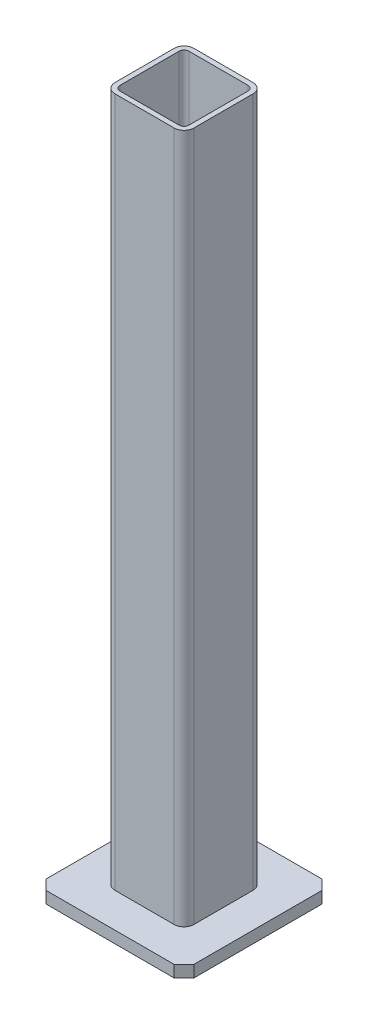
ISO-10303-21;
HEADER;
FILE_DESCRIPTION(('STEP AP214'),'2;1');
FILE_NAME('part.step','',(''),(''),'','','');
FILE_SCHEMA(('AUTOMOTIVE_DESIGN { 1 0 10303 214 1 1 1 1 }'));
ENDSEC;
DATA;
#1=APPLICATION_CONTEXT('core data for automotive mechanical design processes');
#2=APPLICATION_PROTOCOL_DEFINITION('international standard','automotive_design',2000,#1);
#3=PRODUCT_CONTEXT('',#1,'mechanical');
#4=PRODUCT('Part','Part','',(#3));
#5=PRODUCT_RELATED_PRODUCT_CATEGORY('part','',(#4));
#6=PRODUCT_DEFINITION_FORMATION('','',#4);
#7=PRODUCT_DEFINITION_CONTEXT('part definition',#1,'design');
#8=PRODUCT_DEFINITION('design','',#6,#7);
#9=PRODUCT_DEFINITION_SHAPE('','',#8);
#10=(LENGTH_UNIT() NAMED_UNIT(*) SI_UNIT(.MILLI.,.METRE.));
#11=(NAMED_UNIT(*) PLANE_ANGLE_UNIT() SI_UNIT($,.RADIAN.));
#12=(NAMED_UNIT(*) SI_UNIT($,.STERADIAN.) SOLID_ANGLE_UNIT());
#13=UNCERTAINTY_MEASURE_WITH_UNIT(LENGTH_MEASURE(1.E-05),#10,'distance_accuracy_value','');
#14=(GEOMETRIC_REPRESENTATION_CONTEXT(3) GLOBAL_UNCERTAINTY_ASSIGNED_CONTEXT((#13)) GLOBAL_UNIT_ASSIGNED_CONTEXT((#10,
#11,#12)) REPRESENTATION_CONTEXT('',''));
#15=CARTESIAN_POINT('',(0.,0.,0.));
#16=DIRECTION('',(0.,0.,1.));
#17=DIRECTION('',(1.,0.,0.));
#18=AXIS2_PLACEMENT_3D('',#15,#16,#17);
#19=CARTESIAN_POINT('',(-75.,-12.,-75.));
#20=DIRECTION('',(1.,0.,0.));
#21=DIRECTION('',(0.,0.,-1.));
#22=AXIS2_PLACEMENT_3D('',#19,#20,#21);
#23=PLANE('',#22);
#24=DIRECTION('',(0.,0.,-1.));
#25=VECTOR('',#24,1.);
#26=CARTESIAN_POINT('',(-75.,0.,-75.));
#27=LINE('',#26,#25);
#28=CARTESIAN_POINT('',(-75.,0.,64.9999999999999));
#29=VERTEX_POINT('',#28);
#30=CARTESIAN_POINT('',(-75.,0.,-65.));
#31=VERTEX_POINT('',#30);
#32=EDGE_CURVE('E211',#29,#31,#27,.T.);
#33=ORIENTED_EDGE('',*,*,#32,.T.);
#34=DIRECTION('',(0.,-1.,0.));
#35=VECTOR('',#34,1.);
#36=CARTESIAN_POINT('',(-75.,-12.,-65.));
#37=LINE('',#36,#35);
#38=CARTESIAN_POINT('',(-75.,-12.,-65.));
#39=VERTEX_POINT('',#38);
#40=EDGE_CURVE('E91',#31,#39,#37,.T.);
#41=ORIENTED_EDGE('',*,*,#40,.T.);
#42=DIRECTION('',(0.,0.,-1.));
#43=VECTOR('',#42,1.);
#44=CARTESIAN_POINT('',(-75.,-12.,-75.));
#45=LINE('',#44,#43);
#46=CARTESIAN_POINT('',(-75.,-12.,64.9999999999999));
#47=VERTEX_POINT('',#46);
#48=EDGE_CURVE('E170',#47,#39,#45,.T.);
#49=ORIENTED_EDGE('',*,*,#48,.F.);
#50=DIRECTION('',(0.,1.,0.));
#51=VECTOR('',#50,1.);
#52=CARTESIAN_POINT('',(-75.,-12.,64.9999999999999));
#53=LINE('',#52,#51);
#54=EDGE_CURVE('E182',#47,#29,#53,.T.);
#55=ORIENTED_EDGE('',*,*,#54,.T.);
#56=EDGE_LOOP('',(#33,#41,#49,#55));
#57=FACE_BOUND('',#56,.T.);
#58=ADVANCED_FACE('F82',(#57),#23,.F.);
#59=CARTESIAN_POINT('',(75.,-12.,-75.));
#60=DIRECTION('',(0.,0.,1.));
#61=DIRECTION('',(1.,0.,0.));
#62=AXIS2_PLACEMENT_3D('',#59,#60,#61);
#63=PLANE('',#62);
#64=DIRECTION('',(1.,0.,0.));
#65=VECTOR('',#64,1.);
#66=CARTESIAN_POINT('',(75.,-12.,-75.));
#67=LINE('',#66,#65);
#68=CARTESIAN_POINT('',(-64.9999999999999,-12.,-75.));
#69=VERTEX_POINT('',#68);
#70=CARTESIAN_POINT('',(64.9999999999999,-12.,-75.));
#71=VERTEX_POINT('',#70);
#72=EDGE_CURVE('E173',#69,#71,#67,.T.);
#73=ORIENTED_EDGE('',*,*,#72,.F.);
#74=DIRECTION('',(0.,1.,0.));
#75=VECTOR('',#74,1.);
#76=CARTESIAN_POINT('',(-64.9999999999999,-12.,-75.));
#77=LINE('',#76,#75);
#78=CARTESIAN_POINT('',(-64.9999999999999,0.,-75.));
#79=VERTEX_POINT('',#78);
#80=EDGE_CURVE('E201',#69,#79,#77,.T.);
#81=ORIENTED_EDGE('',*,*,#80,.T.);
#82=DIRECTION('',(1.,0.,0.));
#83=VECTOR('',#82,1.);
#84=CARTESIAN_POINT('',(75.,0.,-75.));
#85=LINE('',#84,#83);
#86=CARTESIAN_POINT('',(64.9999999999999,0.,-75.));
#87=VERTEX_POINT('',#86);
#88=EDGE_CURVE('E175',#79,#87,#85,.T.);
#89=ORIENTED_EDGE('',*,*,#88,.T.);
#90=DIRECTION('',(0.,-1.,0.));
#91=VECTOR('',#90,1.);
#92=CARTESIAN_POINT('',(64.9999999999999,-12.,-75.));
#93=LINE('',#92,#91);
#94=EDGE_CURVE('E196',#87,#71,#93,.T.);
#95=ORIENTED_EDGE('',*,*,#94,.T.);
#96=EDGE_LOOP('',(#73,#81,#89,#95));
#97=FACE_BOUND('',#96,.T.);
#98=ADVANCED_FACE('F207',(#97),#63,.F.);
#99=CARTESIAN_POINT('',(75.,-12.,-75.));
#100=DIRECTION('',(-1.,0.,0.));
#101=DIRECTION('',(0.,0.,1.));
#102=AXIS2_PLACEMENT_3D('',#99,#100,#101);
#103=PLANE('',#102);
#104=DIRECTION('',(0.,0.,1.));
#105=VECTOR('',#104,1.);
#106=CARTESIAN_POINT('',(75.,-12.,-75.));
#107=LINE('',#106,#105);
#108=CARTESIAN_POINT('',(75.,-12.,-64.9999999999999));
#109=VERTEX_POINT('',#108);
#110=CARTESIAN_POINT('',(75.,-12.,64.9999999999999));
#111=VERTEX_POINT('',#110);
#112=EDGE_CURVE('E215',#109,#111,#107,.T.);
#113=ORIENTED_EDGE('',*,*,#112,.F.);
#114=DIRECTION('',(0.,1.,0.));
#115=VECTOR('',#114,1.);
#116=CARTESIAN_POINT('',(75.,-12.,-64.9999999999999));
#117=LINE('',#116,#115);
#118=CARTESIAN_POINT('',(75.,0.,-64.9999999999999));
#119=VERTEX_POINT('',#118);
#120=EDGE_CURVE('E190',#109,#119,#117,.T.);
#121=ORIENTED_EDGE('',*,*,#120,.T.);
#122=DIRECTION('',(0.,0.,1.));
#123=VECTOR('',#122,1.);
#124=CARTESIAN_POINT('',(75.,0.,-75.));
#125=LINE('',#124,#123);
#126=CARTESIAN_POINT('',(75.,0.,64.9999999999999));
#127=VERTEX_POINT('',#126);
#128=EDGE_CURVE('E171',#119,#127,#125,.T.);
#129=ORIENTED_EDGE('',*,*,#128,.T.);
#130=DIRECTION('',(0.,-1.,0.));
#131=VECTOR('',#130,1.);
#132=CARTESIAN_POINT('',(75.,-12.,64.9999999999999));
#133=LINE('',#132,#131);
#134=EDGE_CURVE('E155',#127,#111,#133,.T.);
#135=ORIENTED_EDGE('',*,*,#134,.T.);
#136=EDGE_LOOP('',(#113,#121,#129,#135));
#137=FACE_BOUND('',#136,.T.);
#138=ADVANCED_FACE('F225',(#137),#103,.F.);
#139=CARTESIAN_POINT('',(75.,-12.,75.));
#140=DIRECTION('',(0.,0.,-1.));
#141=DIRECTION('',(-1.,0.,0.));
#142=AXIS2_PLACEMENT_3D('',#139,#140,#141);
#143=PLANE('',#142);
#144=DIRECTION('',(-1.,0.,0.));
#145=VECTOR('',#144,1.);
#146=CARTESIAN_POINT('',(75.,0.,75.));
#147=LINE('',#146,#145);
#148=CARTESIAN_POINT('',(64.9999999999999,0.,75.));
#149=VERTEX_POINT('',#148);
#150=CARTESIAN_POINT('',(-64.9999999999999,0.,75.));
#151=VERTEX_POINT('',#150);
#152=EDGE_CURVE('E163',#149,#151,#147,.T.);
#153=ORIENTED_EDGE('',*,*,#152,.T.);
#154=DIRECTION('',(0.,-1.,0.));
#155=VECTOR('',#154,1.);
#156=CARTESIAN_POINT('',(-64.9999999999999,-12.,75.));
#157=LINE('',#156,#155);
#158=CARTESIAN_POINT('',(-64.9999999999999,-12.,75.));
#159=VERTEX_POINT('',#158);
#160=EDGE_CURVE('E186',#151,#159,#157,.T.);
#161=ORIENTED_EDGE('',*,*,#160,.T.);
#162=DIRECTION('',(-1.,0.,0.));
#163=VECTOR('',#162,1.);
#164=CARTESIAN_POINT('',(75.,-12.,75.));
#165=LINE('',#164,#163);
#166=CARTESIAN_POINT('',(64.9999999999999,-12.,75.));
#167=VERTEX_POINT('',#166);
#168=EDGE_CURVE('E166',#167,#159,#165,.T.);
#169=ORIENTED_EDGE('',*,*,#168,.F.);
#170=DIRECTION('',(0.,1.,0.));
#171=VECTOR('',#170,1.);
#172=CARTESIAN_POINT('',(64.9999999999999,-12.,75.));
#173=LINE('',#172,#171);
#174=EDGE_CURVE('E153',#167,#149,#173,.T.);
#175=ORIENTED_EDGE('',*,*,#174,.T.);
#176=EDGE_LOOP('',(#153,#161,#169,#175));
#177=FACE_BOUND('',#176,.T.);
#178=ADVANCED_FACE('F162',(#177),#143,.F.);
#179=CARTESIAN_POINT('',(0.,-12.,0.));
#180=DIRECTION('',(0.,-1.,0.));
#181=DIRECTION('',(0.,0.,-1.));
#182=AXIS2_PLACEMENT_3D('',#179,#180,#181);
#183=PLANE('',#182);
#184=ORIENTED_EDGE('',*,*,#48,.T.);
#185=DIRECTION('',(-0.707106781186548,0.,0.707106781186548));
#186=VECTOR('',#185,1.);
#187=CARTESIAN_POINT('',(-70.,-12.,-70.));
#188=LINE('',#187,#186);
#189=EDGE_CURVE('E13',#39,#69,#188,.F.);
#190=ORIENTED_EDGE('',*,*,#189,.T.);
#191=ORIENTED_EDGE('',*,*,#72,.T.);
#192=DIRECTION('',(-0.707106781186548,0.,-0.707106781186548));
#193=VECTOR('',#192,1.);
#194=CARTESIAN_POINT('',(70.,-12.,-70.));
#195=LINE('',#194,#193);
#196=EDGE_CURVE('E199',#71,#109,#195,.F.);
#197=ORIENTED_EDGE('',*,*,#196,.T.);
#198=ORIENTED_EDGE('',*,*,#112,.T.);
#199=DIRECTION('',(0.707106781186548,0.,-0.707106781186547));
#200=VECTOR('',#199,1.);
#201=CARTESIAN_POINT('',(69.9999999999999,-12.,70.));
#202=LINE('',#201,#200);
#203=EDGE_CURVE('E180',#111,#167,#202,.F.);
#204=ORIENTED_EDGE('',*,*,#203,.T.);
#205=ORIENTED_EDGE('',*,*,#168,.T.);
#206=DIRECTION('',(0.707106781186548,0.,0.707106781186548));
#207=VECTOR('',#206,1.);
#208=CARTESIAN_POINT('',(-70.,-12.,70.));
#209=LINE('',#208,#207);
#210=EDGE_CURVE('E188',#159,#47,#209,.F.);
#211=ORIENTED_EDGE('',*,*,#210,.T.);
#212=EDGE_LOOP('',(#184,#190,#191,#197,#198,#204,#205,#211));
#213=FACE_BOUND('',#212,.T.);
#214=ADVANCED_FACE('F218',(#213),#183,.T.);
#215=CARTESIAN_POINT('',(0.,0.,0.));
#216=DIRECTION('',(0.,-1.,0.));
#217=DIRECTION('',(0.,0.,-1.));
#218=AXIS2_PLACEMENT_3D('',#215,#216,#217);
#219=PLANE('',#218);
#220=ORIENTED_EDGE('',*,*,#88,.F.);
#221=DIRECTION('',(0.707106781186548,0.,-0.707106781186548));
#222=VECTOR('',#221,1.);
#223=CARTESIAN_POINT('',(-64.9999999999999,0.,-75.));
#224=LINE('',#223,#222);
#225=EDGE_CURVE('E105',#79,#31,#224,.F.);
#226=ORIENTED_EDGE('',*,*,#225,.T.);
#227=ORIENTED_EDGE('',*,*,#32,.F.);
#228=DIRECTION('',(-0.707106781186548,0.,-0.707106781186548));
#229=VECTOR('',#228,1.);
#230=CARTESIAN_POINT('',(-75.,0.,64.9999999999999));
#231=LINE('',#230,#229);
#232=EDGE_CURVE('E169',#29,#151,#231,.F.);
#233=ORIENTED_EDGE('',*,*,#232,.T.);
#234=ORIENTED_EDGE('',*,*,#152,.F.);
#235=DIRECTION('',(-0.707106781186548,0.,0.707106781186547));
#236=VECTOR('',#235,1.);
#237=CARTESIAN_POINT('',(64.9999999999999,0.,75.));
#238=LINE('',#237,#236);
#239=EDGE_CURVE('E149',#149,#127,#238,.F.);
#240=ORIENTED_EDGE('',*,*,#239,.T.);
#241=ORIENTED_EDGE('',*,*,#128,.F.);
#242=DIRECTION('',(0.707106781186548,0.,0.707106781186548));
#243=VECTOR('',#242,1.);
#244=CARTESIAN_POINT('',(75.,0.,-64.9999999999999));
#245=LINE('',#244,#243);
#246=EDGE_CURVE('E193',#119,#87,#245,.F.);
#247=ORIENTED_EDGE('',*,*,#246,.T.);
#248=EDGE_LOOP('',(#220,#226,#227,#233,#234,#240,#241,#247));
#249=FACE_BOUND('',#248,.T.);
#250=ADVANCED_FACE('F168',(#249),#219,.F.);
#251=CARTESIAN_POINT('',(64.9999999999999,-12.,75.));
#252=DIRECTION('',(-0.707106781186547,0.,-0.707106781186548));
#253=DIRECTION('',(0.,1.,0.));
#254=AXIS2_PLACEMENT_3D('',#251,#252,#253);
#255=PLANE('',#254);
#256=ORIENTED_EDGE('',*,*,#203,.F.);
#257=ORIENTED_EDGE('',*,*,#134,.F.);
#258=ORIENTED_EDGE('',*,*,#239,.F.);
#259=ORIENTED_EDGE('',*,*,#174,.F.);
#260=EDGE_LOOP('',(#256,#257,#258,#259));
#261=FACE_BOUND('',#260,.T.);
#262=ADVANCED_FACE('F152',(#261),#255,.F.);
#263=CARTESIAN_POINT('',(-75.,-12.,64.9999999999999));
#264=DIRECTION('',(0.707106781186547,0.,-0.707106781186547));
#265=DIRECTION('',(0.,1.,0.));
#266=AXIS2_PLACEMENT_3D('',#263,#264,#265);
#267=PLANE('',#266);
#268=ORIENTED_EDGE('',*,*,#210,.F.);
#269=ORIENTED_EDGE('',*,*,#160,.F.);
#270=ORIENTED_EDGE('',*,*,#232,.F.);
#271=ORIENTED_EDGE('',*,*,#54,.F.);
#272=EDGE_LOOP('',(#268,#269,#270,#271));
#273=FACE_BOUND('',#272,.T.);
#274=ADVANCED_FACE('F229',(#273),#267,.F.);
#275=CARTESIAN_POINT('',(75.,-12.,-64.9999999999999));
#276=DIRECTION('',(-0.707106781186548,0.,0.707106781186548));
#277=DIRECTION('',(0.,1.,0.));
#278=AXIS2_PLACEMENT_3D('',#275,#276,#277);
#279=PLANE('',#278);
#280=ORIENTED_EDGE('',*,*,#196,.F.);
#281=ORIENTED_EDGE('',*,*,#94,.F.);
#282=ORIENTED_EDGE('',*,*,#246,.F.);
#283=ORIENTED_EDGE('',*,*,#120,.F.);
#284=EDGE_LOOP('',(#280,#281,#282,#283));
#285=FACE_BOUND('',#284,.T.);
#286=ADVANCED_FACE('F223',(#285),#279,.F.);
#287=CARTESIAN_POINT('',(-64.9999999999999,-12.,-75.));
#288=DIRECTION('',(0.707106781186547,0.,0.707106781186547));
#289=DIRECTION('',(0.,1.,0.));
#290=AXIS2_PLACEMENT_3D('',#287,#288,#289);
#291=PLANE('',#290);
#292=ORIENTED_EDGE('',*,*,#189,.F.);
#293=ORIENTED_EDGE('',*,*,#40,.F.);
#294=ORIENTED_EDGE('',*,*,#225,.F.);
#295=ORIENTED_EDGE('',*,*,#80,.F.);
#296=EDGE_LOOP('',(#292,#293,#294,#295));
#297=FACE_BOUND('',#296,.T.);
#298=ADVANCED_FACE('F85',(#297),#291,.F.);
#299=CLOSED_SHELL('',(#58,#98,#138,#178,#214,#250,#262,#274,#286,#298));
#300=MANIFOLD_SOLID_BREP('B2',#299);
#301=CARTESIAN_POINT('',(-30.,700.,30.));
#302=DIRECTION('',(0.,-1.,0.));
#303=DIRECTION('',(0.,0.,-1.));
#304=AXIS2_PLACEMENT_3D('',#301,#302,#303);
#305=CYLINDRICAL_SURFACE('',#304,10.);
#306=CARTESIAN_POINT('',(-30.,0.,30.));
#307=DIRECTION('',(0.,1.,0.));
#308=DIRECTION('',(0.,0.,1.));
#309=AXIS2_PLACEMENT_3D('',#306,#307,#308);
#310=CIRCLE('',#309,10.);
#311=CARTESIAN_POINT('',(-40.,0.,30.));
#312=VERTEX_POINT('',#311);
#313=CARTESIAN_POINT('',(-30.,0.,40.));
#314=VERTEX_POINT('',#313);
#315=EDGE_CURVE('E513',#312,#314,#310,.T.);
#316=ORIENTED_EDGE('',*,*,#315,.T.);
#317=DIRECTION('',(0.,-1.,0.));
#318=VECTOR('',#317,1.);
#319=CARTESIAN_POINT('',(-30.,700.,40.));
#320=LINE('',#319,#318);
#321=CARTESIAN_POINT('',(-30.,700.,40.));
#322=VERTEX_POINT('',#321);
#323=EDGE_CURVE('E80',#322,#314,#320,.T.);
#324=ORIENTED_EDGE('',*,*,#323,.F.);
#325=CARTESIAN_POINT('',(-30.,700.,30.));
#326=DIRECTION('',(0.,1.,0.));
#327=DIRECTION('',(0.,0.,1.));
#328=AXIS2_PLACEMENT_3D('',#325,#326,#327);
#329=CIRCLE('',#328,10.);
#330=CARTESIAN_POINT('',(-40.,700.,30.));
#331=VERTEX_POINT('',#330);
#332=EDGE_CURVE('E591',#331,#322,#329,.T.);
#333=ORIENTED_EDGE('',*,*,#332,.F.);
#334=DIRECTION('',(0.,-1.,0.));
#335=VECTOR('',#334,1.);
#336=CARTESIAN_POINT('',(-40.,700.,30.));
#337=LINE('',#336,#335);
#338=EDGE_CURVE('E528',#331,#312,#337,.T.);
#339=ORIENTED_EDGE('',*,*,#338,.T.);
#340=EDGE_LOOP('',(#316,#324,#333,#339));
#341=FACE_BOUND('',#340,.T.);
#342=ADVANCED_FACE('F341',(#341),#305,.T.);
#343=CARTESIAN_POINT('',(-30.,700.,40.));
#344=DIRECTION('',(0.,0.,-1.));
#345=DIRECTION('',(-1.,0.,0.));
#346=AXIS2_PLACEMENT_3D('',#343,#344,#345);
#347=PLANE('',#346);
#348=DIRECTION('',(1.,0.,0.));
#349=VECTOR('',#348,1.);
#350=CARTESIAN_POINT('',(-30.,0.,40.));
#351=LINE('',#350,#349);
#352=CARTESIAN_POINT('',(30.,0.,40.));
#353=VERTEX_POINT('',#352);
#354=EDGE_CURVE('E516',#314,#353,#351,.T.);
#355=ORIENTED_EDGE('',*,*,#354,.T.);
#356=DIRECTION('',(0.,-1.,0.));
#357=VECTOR('',#356,1.);
#358=CARTESIAN_POINT('',(30.,700.,40.));
#359=LINE('',#358,#357);
#360=CARTESIAN_POINT('',(30.,700.,40.));
#361=VERTEX_POINT('',#360);
#362=EDGE_CURVE('E351',#361,#353,#359,.T.);
#363=ORIENTED_EDGE('',*,*,#362,.F.);
#364=DIRECTION('',(1.,0.,0.));
#365=VECTOR('',#364,1.);
#366=CARTESIAN_POINT('',(-30.,700.,40.));
#367=LINE('',#366,#365);
#368=EDGE_CURVE('E593',#322,#361,#367,.T.);
#369=ORIENTED_EDGE('',*,*,#368,.F.);
#370=ORIENTED_EDGE('',*,*,#323,.T.);
#371=EDGE_LOOP('',(#355,#363,#369,#370));
#372=FACE_BOUND('',#371,.T.);
#373=ADVANCED_FACE('F628',(#372),#347,.F.);
#374=CARTESIAN_POINT('',(30.,700.,30.));
#375=DIRECTION('',(0.,-1.,0.));
#376=DIRECTION('',(0.,0.,-1.));
#377=AXIS2_PLACEMENT_3D('',#374,#375,#376);
#378=CYLINDRICAL_SURFACE('',#377,10.);
#379=CARTESIAN_POINT('',(30.,0.,30.));
#380=DIRECTION('',(0.,1.,0.));
#381=DIRECTION('',(0.,0.,1.));
#382=AXIS2_PLACEMENT_3D('',#379,#380,#381);
#383=CIRCLE('',#382,10.);
#384=CARTESIAN_POINT('',(40.,0.,30.));
#385=VERTEX_POINT('',#384);
#386=EDGE_CURVE('E518',#353,#385,#383,.T.);
#387=ORIENTED_EDGE('',*,*,#386,.T.);
#388=DIRECTION('',(0.,-1.,0.));
#389=VECTOR('',#388,1.);
#390=CARTESIAN_POINT('',(40.,700.,30.));
#391=LINE('',#390,#389);
#392=CARTESIAN_POINT('',(40.,700.,30.));
#393=VERTEX_POINT('',#392);
#394=EDGE_CURVE('E535',#393,#385,#391,.T.);
#395=ORIENTED_EDGE('',*,*,#394,.F.);
#396=CARTESIAN_POINT('',(30.,700.,30.));
#397=DIRECTION('',(0.,1.,0.));
#398=DIRECTION('',(0.,0.,1.));
#399=AXIS2_PLACEMENT_3D('',#396,#397,#398);
#400=CIRCLE('',#399,10.);
#401=EDGE_CURVE('E595',#361,#393,#400,.T.);
#402=ORIENTED_EDGE('',*,*,#401,.F.);
#403=ORIENTED_EDGE('',*,*,#362,.T.);
#404=EDGE_LOOP('',(#387,#395,#402,#403));
#405=FACE_BOUND('',#404,.T.);
#406=ADVANCED_FACE('F633',(#405),#378,.T.);
#407=CARTESIAN_POINT('',(40.,700.,-30.));
#408=DIRECTION('',(-1.,0.,0.));
#409=DIRECTION('',(0.,0.,1.));
#410=AXIS2_PLACEMENT_3D('',#407,#408,#409);
#411=PLANE('',#410);
#412=DIRECTION('',(0.,0.,-1.));
#413=VECTOR('',#412,1.);
#414=CARTESIAN_POINT('',(40.,0.,-30.));
#415=LINE('',#414,#413);
#416=CARTESIAN_POINT('',(40.,0.,-30.));
#417=VERTEX_POINT('',#416);
#418=EDGE_CURVE('E520',#385,#417,#415,.T.);
#419=ORIENTED_EDGE('',*,*,#418,.T.);
#420=DIRECTION('',(0.,-1.,0.));
#421=VECTOR('',#420,1.);
#422=CARTESIAN_POINT('',(40.,700.,-30.));
#423=LINE('',#422,#421);
#424=CARTESIAN_POINT('',(40.,700.,-30.));
#425=VERTEX_POINT('',#424);
#426=EDGE_CURVE('E532',#425,#417,#423,.T.);
#427=ORIENTED_EDGE('',*,*,#426,.F.);
#428=DIRECTION('',(0.,0.,-1.));
#429=VECTOR('',#428,1.);
#430=CARTESIAN_POINT('',(40.,700.,-30.));
#431=LINE('',#430,#429);
#432=EDGE_CURVE('E597',#393,#425,#431,.T.);
#433=ORIENTED_EDGE('',*,*,#432,.F.);
#434=ORIENTED_EDGE('',*,*,#394,.T.);
#435=EDGE_LOOP('',(#419,#427,#433,#434));
#436=FACE_BOUND('',#435,.T.);
#437=ADVANCED_FACE('F603',(#436),#411,.F.);
#438=CARTESIAN_POINT('',(30.,700.,-30.));
#439=DIRECTION('',(0.,-1.,0.));
#440=DIRECTION('',(0.,0.,-1.));
#441=AXIS2_PLACEMENT_3D('',#438,#439,#440);
#442=CYLINDRICAL_SURFACE('',#441,10.);
#443=CARTESIAN_POINT('',(30.,0.,-30.));
#444=DIRECTION('',(0.,1.,0.));
#445=DIRECTION('',(0.,0.,1.));
#446=AXIS2_PLACEMENT_3D('',#443,#444,#445);
#447=CIRCLE('',#446,10.);
#448=CARTESIAN_POINT('',(30.,0.,-40.));
#449=VERTEX_POINT('',#448);
#450=EDGE_CURVE('E522',#417,#449,#447,.T.);
#451=ORIENTED_EDGE('',*,*,#450,.T.);
#452=DIRECTION('',(0.,-1.,0.));
#453=VECTOR('',#452,1.);
#454=CARTESIAN_POINT('',(30.,700.,-40.));
#455=LINE('',#454,#453);
#456=CARTESIAN_POINT('',(30.,700.,-40.));
#457=VERTEX_POINT('',#456);
#458=EDGE_CURVE('E480',#457,#449,#455,.T.);
#459=ORIENTED_EDGE('',*,*,#458,.F.);
#460=CARTESIAN_POINT('',(30.,700.,-30.));
#461=DIRECTION('',(0.,1.,0.));
#462=DIRECTION('',(0.,0.,1.));
#463=AXIS2_PLACEMENT_3D('',#460,#461,#462);
#464=CIRCLE('',#463,10.);
#465=EDGE_CURVE('E471',#425,#457,#464,.T.);
#466=ORIENTED_EDGE('',*,*,#465,.F.);
#467=ORIENTED_EDGE('',*,*,#426,.T.);
#468=EDGE_LOOP('',(#451,#459,#466,#467));
#469=FACE_BOUND('',#468,.T.);
#470=ADVANCED_FACE('F607',(#469),#442,.T.);
#471=CARTESIAN_POINT('',(30.,700.,-40.));
#472=DIRECTION('',(0.,0.,1.));
#473=DIRECTION('',(1.,0.,0.));
#474=AXIS2_PLACEMENT_3D('',#471,#472,#473);
#475=PLANE('',#474);
#476=DIRECTION('',(-1.,0.,0.));
#477=VECTOR('',#476,1.);
#478=CARTESIAN_POINT('',(30.,0.,-40.));
#479=LINE('',#478,#477);
#480=CARTESIAN_POINT('',(-30.,0.,-40.));
#481=VERTEX_POINT('',#480);
#482=EDGE_CURVE('E479',#449,#481,#479,.T.);
#483=ORIENTED_EDGE('',*,*,#482,.T.);
#484=DIRECTION('',(0.,-1.,0.));
#485=VECTOR('',#484,1.);
#486=CARTESIAN_POINT('',(-30.,700.,-40.));
#487=LINE('',#486,#485);
#488=CARTESIAN_POINT('',(-30.,700.,-40.));
#489=VERTEX_POINT('',#488);
#490=EDGE_CURVE('E476',#489,#481,#487,.T.);
#491=ORIENTED_EDGE('',*,*,#490,.F.);
#492=DIRECTION('',(-1.,0.,0.));
#493=VECTOR('',#492,1.);
#494=CARTESIAN_POINT('',(30.,700.,-40.));
#495=LINE('',#494,#493);
#496=EDGE_CURVE('E465',#457,#489,#495,.T.);
#497=ORIENTED_EDGE('',*,*,#496,.F.);
#498=ORIENTED_EDGE('',*,*,#458,.T.);
#499=EDGE_LOOP('',(#483,#491,#497,#498));
#500=FACE_BOUND('',#499,.T.);
#501=ADVANCED_FACE('F477',(#500),#475,.F.);
#502=CARTESIAN_POINT('',(-30.,700.,-30.));
#503=DIRECTION('',(0.,-1.,0.));
#504=DIRECTION('',(0.,0.,-1.));
#505=AXIS2_PLACEMENT_3D('',#502,#503,#504);
#506=CYLINDRICAL_SURFACE('',#505,10.);
#507=CARTESIAN_POINT('',(-30.,0.,-30.));
#508=DIRECTION('',(0.,1.,0.));
#509=DIRECTION('',(0.,0.,1.));
#510=AXIS2_PLACEMENT_3D('',#507,#508,#509);
#511=CIRCLE('',#510,10.);
#512=CARTESIAN_POINT('',(-40.,0.,-30.));
#513=VERTEX_POINT('',#512);
#514=EDGE_CURVE('E413',#481,#513,#511,.T.);
#515=ORIENTED_EDGE('',*,*,#514,.T.);
#516=DIRECTION('',(0.,-1.,0.));
#517=VECTOR('',#516,1.);
#518=CARTESIAN_POINT('',(-40.,700.,-30.));
#519=LINE('',#518,#517);
#520=CARTESIAN_POINT('',(-40.,700.,-30.));
#521=VERTEX_POINT('',#520);
#522=EDGE_CURVE('E481',#521,#513,#519,.T.);
#523=ORIENTED_EDGE('',*,*,#522,.F.);
#524=CARTESIAN_POINT('',(-30.,700.,-30.));
#525=DIRECTION('',(0.,1.,0.));
#526=DIRECTION('',(0.,0.,1.));
#527=AXIS2_PLACEMENT_3D('',#524,#525,#526);
#528=CIRCLE('',#527,10.);
#529=EDGE_CURVE('E469',#489,#521,#528,.T.);
#530=ORIENTED_EDGE('',*,*,#529,.F.);
#531=ORIENTED_EDGE('',*,*,#490,.T.);
#532=EDGE_LOOP('',(#515,#523,#530,#531));
#533=FACE_BOUND('',#532,.T.);
#534=ADVANCED_FACE('F483',(#533),#506,.T.);
#535=CARTESIAN_POINT('',(30.,700.,30.));
#536=DIRECTION('',(0.,-1.,0.));
#537=DIRECTION('',(0.,0.,-1.));
#538=AXIS2_PLACEMENT_3D('',#535,#536,#537);
#539=CYLINDRICAL_SURFACE('',#538,5.);
#540=CARTESIAN_POINT('',(30.,0.,30.));
#541=DIRECTION('',(0.,1.,0.));
#542=DIRECTION('',(0.,0.,1.));
#543=AXIS2_PLACEMENT_3D('',#540,#541,#542);
#544=CIRCLE('',#543,5.);
#545=CARTESIAN_POINT('',(30.,0.,35.));
#546=VERTEX_POINT('',#545);
#547=CARTESIAN_POINT('',(35.,0.,30.));
#548=VERTEX_POINT('',#547);
#549=EDGE_CURVE('E489',#546,#548,#544,.T.);
#550=ORIENTED_EDGE('',*,*,#549,.F.);
#551=DIRECTION('',(0.,-1.,0.));
#552=VECTOR('',#551,1.);
#553=CARTESIAN_POINT('',(30.,700.,35.));
#554=LINE('',#553,#552);
#555=CARTESIAN_POINT('',(30.,700.,35.));
#556=VERTEX_POINT('',#555);
#557=EDGE_CURVE('E345',#556,#546,#554,.T.);
#558=ORIENTED_EDGE('',*,*,#557,.F.);
#559=CARTESIAN_POINT('',(30.,700.,30.));
#560=DIRECTION('',(0.,1.,0.));
#561=DIRECTION('',(0.,0.,1.));
#562=AXIS2_PLACEMENT_3D('',#559,#560,#561);
#563=CIRCLE('',#562,5.);
#564=CARTESIAN_POINT('',(35.,700.,30.));
#565=VERTEX_POINT('',#564);
#566=EDGE_CURVE('E527',#556,#565,#563,.T.);
#567=ORIENTED_EDGE('',*,*,#566,.T.);
#568=DIRECTION('',(0.,-1.,0.));
#569=VECTOR('',#568,1.);
#570=CARTESIAN_POINT('',(35.,700.,30.));
#571=LINE('',#570,#569);
#572=EDGE_CURVE('E485',#565,#548,#571,.T.);
#573=ORIENTED_EDGE('',*,*,#572,.T.);
#574=EDGE_LOOP('',(#550,#558,#567,#573));
#575=FACE_BOUND('',#574,.T.);
#576=ADVANCED_FACE('F343',(#575),#539,.F.);
#577=CARTESIAN_POINT('',(-30.,700.,35.));
#578=DIRECTION('',(0.,0.,-1.));
#579=DIRECTION('',(-1.,0.,0.));
#580=AXIS2_PLACEMENT_3D('',#577,#578,#579);
#581=PLANE('',#580);
#582=DIRECTION('',(1.,0.,0.));
#583=VECTOR('',#582,1.);
#584=CARTESIAN_POINT('',(-30.,0.,35.));
#585=LINE('',#584,#583);
#586=CARTESIAN_POINT('',(-30.,0.,35.));
#587=VERTEX_POINT('',#586);
#588=EDGE_CURVE('E492',#587,#546,#585,.T.);
#589=ORIENTED_EDGE('',*,*,#588,.F.);
#590=DIRECTION('',(0.,-1.,0.));
#591=VECTOR('',#590,1.);
#592=CARTESIAN_POINT('',(-30.,700.,35.));
#593=LINE('',#592,#591);
#594=CARTESIAN_POINT('',(-30.,700.,35.));
#595=VERTEX_POINT('',#594);
#596=EDGE_CURVE('E550',#595,#587,#593,.T.);
#597=ORIENTED_EDGE('',*,*,#596,.F.);
#598=DIRECTION('',(1.,0.,0.));
#599=VECTOR('',#598,1.);
#600=CARTESIAN_POINT('',(-30.,700.,35.));
#601=LINE('',#600,#599);
#602=EDGE_CURVE('E559',#595,#556,#601,.T.);
#603=ORIENTED_EDGE('',*,*,#602,.T.);
#604=ORIENTED_EDGE('',*,*,#557,.T.);
#605=EDGE_LOOP('',(#589,#597,#603,#604));
#606=FACE_BOUND('',#605,.T.);
#607=ADVANCED_FACE('F557',(#606),#581,.T.);
#608=CARTESIAN_POINT('',(-30.,700.,30.));
#609=DIRECTION('',(0.,-1.,0.));
#610=DIRECTION('',(0.,0.,-1.));
#611=AXIS2_PLACEMENT_3D('',#608,#609,#610);
#612=CYLINDRICAL_SURFACE('',#611,5.);
#613=CARTESIAN_POINT('',(-30.,0.,30.));
#614=DIRECTION('',(0.,1.,0.));
#615=DIRECTION('',(0.,0.,1.));
#616=AXIS2_PLACEMENT_3D('',#613,#614,#615);
#617=CIRCLE('',#616,5.);
#618=CARTESIAN_POINT('',(-35.,0.,30.));
#619=VERTEX_POINT('',#618);
#620=EDGE_CURVE('E495',#619,#587,#617,.T.);
#621=ORIENTED_EDGE('',*,*,#620,.F.);
#622=DIRECTION('',(0.,-1.,0.));
#623=VECTOR('',#622,1.);
#624=CARTESIAN_POINT('',(-35.,700.,30.));
#625=LINE('',#624,#623);
#626=CARTESIAN_POINT('',(-35.,700.,30.));
#627=VERTEX_POINT('',#626);
#628=EDGE_CURVE('E549',#627,#619,#625,.T.);
#629=ORIENTED_EDGE('',*,*,#628,.F.);
#630=CARTESIAN_POINT('',(-30.,700.,30.));
#631=DIRECTION('',(0.,1.,0.));
#632=DIRECTION('',(0.,0.,1.));
#633=AXIS2_PLACEMENT_3D('',#630,#631,#632);
#634=CIRCLE('',#633,5.);
#635=EDGE_CURVE('E567',#627,#595,#634,.T.);
#636=ORIENTED_EDGE('',*,*,#635,.T.);
#637=ORIENTED_EDGE('',*,*,#596,.T.);
#638=EDGE_LOOP('',(#621,#629,#636,#637));
#639=FACE_BOUND('',#638,.T.);
#640=ADVANCED_FACE('F565',(#639),#612,.F.);
#641=CARTESIAN_POINT('',(-35.,700.,30.));
#642=DIRECTION('',(1.,0.,0.));
#643=DIRECTION('',(0.,0.,-1.));
#644=AXIS2_PLACEMENT_3D('',#641,#642,#643);
#645=PLANE('',#644);
#646=DIRECTION('',(0.,0.,1.));
#647=VECTOR('',#646,1.);
#648=CARTESIAN_POINT('',(-35.,0.,30.));
#649=LINE('',#648,#647);
#650=CARTESIAN_POINT('',(-35.,0.,-30.));
#651=VERTEX_POINT('',#650);
#652=EDGE_CURVE('E498',#651,#619,#649,.T.);
#653=ORIENTED_EDGE('',*,*,#652,.F.);
#654=DIRECTION('',(0.,-1.,0.));
#655=VECTOR('',#654,1.);
#656=CARTESIAN_POINT('',(-35.,700.,-30.));
#657=LINE('',#656,#655);
#658=CARTESIAN_POINT('',(-35.,700.,-30.));
#659=VERTEX_POINT('',#658);
#660=EDGE_CURVE('E547',#659,#651,#657,.T.);
#661=ORIENTED_EDGE('',*,*,#660,.F.);
#662=DIRECTION('',(0.,0.,1.));
#663=VECTOR('',#662,1.);
#664=CARTESIAN_POINT('',(-35.,700.,30.));
#665=LINE('',#664,#663);
#666=EDGE_CURVE('E573',#659,#627,#665,.T.);
#667=ORIENTED_EDGE('',*,*,#666,.T.);
#668=ORIENTED_EDGE('',*,*,#628,.T.);
#669=EDGE_LOOP('',(#653,#661,#667,#668));
#670=FACE_BOUND('',#669,.T.);
#671=ADVANCED_FACE('F576',(#670),#645,.T.);
#672=CARTESIAN_POINT('',(-30.,700.,-30.));
#673=DIRECTION('',(0.,-1.,0.));
#674=DIRECTION('',(0.,0.,-1.));
#675=AXIS2_PLACEMENT_3D('',#672,#673,#674);
#676=CYLINDRICAL_SURFACE('',#675,5.);
#677=CARTESIAN_POINT('',(-30.,0.,-30.));
#678=DIRECTION('',(0.,1.,0.));
#679=DIRECTION('',(0.,0.,1.));
#680=AXIS2_PLACEMENT_3D('',#677,#678,#679);
#681=CIRCLE('',#680,5.);
#682=CARTESIAN_POINT('',(-30.,0.,-35.));
#683=VERTEX_POINT('',#682);
#684=EDGE_CURVE('E501',#683,#651,#681,.T.);
#685=ORIENTED_EDGE('',*,*,#684,.F.);
#686=DIRECTION('',(0.,-1.,0.));
#687=VECTOR('',#686,1.);
#688=CARTESIAN_POINT('',(-30.,700.,-35.));
#689=LINE('',#688,#687);
#690=CARTESIAN_POINT('',(-30.,700.,-35.));
#691=VERTEX_POINT('',#690);
#692=EDGE_CURVE('E545',#691,#683,#689,.T.);
#693=ORIENTED_EDGE('',*,*,#692,.F.);
#694=CARTESIAN_POINT('',(-30.,700.,-30.));
#695=DIRECTION('',(0.,1.,0.));
#696=DIRECTION('',(0.,0.,1.));
#697=AXIS2_PLACEMENT_3D('',#694,#695,#696);
#698=CIRCLE('',#697,5.);
#699=EDGE_CURVE('E577',#691,#659,#698,.T.);
#700=ORIENTED_EDGE('',*,*,#699,.T.);
#701=ORIENTED_EDGE('',*,*,#660,.T.);
#702=EDGE_LOOP('',(#685,#693,#700,#701));
#703=FACE_BOUND('',#702,.T.);
#704=ADVANCED_FACE('F644',(#703),#676,.F.);
#705=CARTESIAN_POINT('',(30.,700.,-35.));
#706=DIRECTION('',(0.,0.,1.));
#707=DIRECTION('',(1.,0.,0.));
#708=AXIS2_PLACEMENT_3D('',#705,#706,#707);
#709=PLANE('',#708);
#710=DIRECTION('',(-1.,0.,0.));
#711=VECTOR('',#710,1.);
#712=CARTESIAN_POINT('',(30.,0.,-35.));
#713=LINE('',#712,#711);
#714=CARTESIAN_POINT('',(30.,0.,-35.));
#715=VERTEX_POINT('',#714);
#716=EDGE_CURVE('E504',#715,#683,#713,.T.);
#717=ORIENTED_EDGE('',*,*,#716,.F.);
#718=DIRECTION('',(0.,-1.,0.));
#719=VECTOR('',#718,1.);
#720=CARTESIAN_POINT('',(30.,700.,-35.));
#721=LINE('',#720,#719);
#722=CARTESIAN_POINT('',(30.,700.,-35.));
#723=VERTEX_POINT('',#722);
#724=EDGE_CURVE('E543',#723,#715,#721,.T.);
#725=ORIENTED_EDGE('',*,*,#724,.F.);
#726=DIRECTION('',(-1.,0.,0.));
#727=VECTOR('',#726,1.);
#728=CARTESIAN_POINT('',(30.,700.,-35.));
#729=LINE('',#728,#727);
#730=EDGE_CURVE('E579',#723,#691,#729,.T.);
#731=ORIENTED_EDGE('',*,*,#730,.T.);
#732=ORIENTED_EDGE('',*,*,#692,.T.);
#733=EDGE_LOOP('',(#717,#725,#731,#732));
#734=FACE_BOUND('',#733,.T.);
#735=ADVANCED_FACE('F640',(#734),#709,.T.);
#736=CARTESIAN_POINT('',(30.,700.,-30.));
#737=DIRECTION('',(0.,-1.,0.));
#738=DIRECTION('',(0.,0.,-1.));
#739=AXIS2_PLACEMENT_3D('',#736,#737,#738);
#740=CYLINDRICAL_SURFACE('',#739,5.);
#741=CARTESIAN_POINT('',(30.,0.,-30.));
#742=DIRECTION('',(0.,1.,0.));
#743=DIRECTION('',(0.,0.,1.));
#744=AXIS2_PLACEMENT_3D('',#741,#742,#743);
#745=CIRCLE('',#744,5.);
#746=CARTESIAN_POINT('',(35.,0.,-30.));
#747=VERTEX_POINT('',#746);
#748=EDGE_CURVE('E507',#747,#715,#745,.T.);
#749=ORIENTED_EDGE('',*,*,#748,.F.);
#750=DIRECTION('',(0.,-1.,0.));
#751=VECTOR('',#750,1.);
#752=CARTESIAN_POINT('',(35.,700.,-30.));
#753=LINE('',#752,#751);
#754=CARTESIAN_POINT('',(35.,700.,-30.));
#755=VERTEX_POINT('',#754);
#756=EDGE_CURVE('E541',#755,#747,#753,.T.);
#757=ORIENTED_EDGE('',*,*,#756,.F.);
#758=CARTESIAN_POINT('',(30.,700.,-30.));
#759=DIRECTION('',(0.,1.,0.));
#760=DIRECTION('',(0.,0.,1.));
#761=AXIS2_PLACEMENT_3D('',#758,#759,#760);
#762=CIRCLE('',#761,5.);
#763=EDGE_CURVE('E585',#755,#723,#762,.T.);
#764=ORIENTED_EDGE('',*,*,#763,.T.);
#765=ORIENTED_EDGE('',*,*,#724,.T.);
#766=EDGE_LOOP('',(#749,#757,#764,#765));
#767=FACE_BOUND('',#766,.T.);
#768=ADVANCED_FACE('F622',(#767),#740,.F.);
#769=CARTESIAN_POINT('',(35.,700.,-30.));
#770=DIRECTION('',(-1.,0.,0.));
#771=DIRECTION('',(0.,0.,1.));
#772=AXIS2_PLACEMENT_3D('',#769,#770,#771);
#773=PLANE('',#772);
#774=DIRECTION('',(0.,0.,-1.));
#775=VECTOR('',#774,1.);
#776=CARTESIAN_POINT('',(35.,0.,-30.));
#777=LINE('',#776,#775);
#778=EDGE_CURVE('E510',#548,#747,#777,.T.);
#779=ORIENTED_EDGE('',*,*,#778,.F.);
#780=ORIENTED_EDGE('',*,*,#572,.F.);
#781=DIRECTION('',(0.,0.,-1.));
#782=VECTOR('',#781,1.);
#783=CARTESIAN_POINT('',(35.,700.,-30.));
#784=LINE('',#783,#782);
#785=EDGE_CURVE('E588',#565,#755,#784,.T.);
#786=ORIENTED_EDGE('',*,*,#785,.T.);
#787=ORIENTED_EDGE('',*,*,#756,.T.);
#788=EDGE_LOOP('',(#779,#780,#786,#787));
#789=FACE_BOUND('',#788,.T.);
#790=ADVANCED_FACE('F615',(#789),#773,.T.);
#791=CARTESIAN_POINT('',(-40.,700.,30.));
#792=DIRECTION('',(1.,0.,0.));
#793=DIRECTION('',(0.,0.,-1.));
#794=AXIS2_PLACEMENT_3D('',#791,#792,#793);
#795=PLANE('',#794);
#796=DIRECTION('',(0.,0.,1.));
#797=VECTOR('',#796,1.);
#798=CARTESIAN_POINT('',(-40.,0.,30.));
#799=LINE('',#798,#797);
#800=EDGE_CURVE('E419',#513,#312,#799,.T.);
#801=ORIENTED_EDGE('',*,*,#800,.T.);
#802=ORIENTED_EDGE('',*,*,#338,.F.);
#803=DIRECTION('',(0.,0.,1.));
#804=VECTOR('',#803,1.);
#805=CARTESIAN_POINT('',(-40.,700.,30.));
#806=LINE('',#805,#804);
#807=EDGE_CURVE('E360',#521,#331,#806,.T.);
#808=ORIENTED_EDGE('',*,*,#807,.F.);
#809=ORIENTED_EDGE('',*,*,#522,.T.);
#810=EDGE_LOOP('',(#801,#802,#808,#809));
#811=FACE_BOUND('',#810,.T.);
#812=ADVANCED_FACE('F613',(#811),#795,.F.);
#813=CARTESIAN_POINT('',(-30.,700.,30.));
#814=DIRECTION('',(0.,1.,0.));
#815=DIRECTION('',(0.,0.,1.));
#816=AXIS2_PLACEMENT_3D('',#813,#814,#815);
#817=PLANE('',#816);
#818=ORIENTED_EDGE('',*,*,#566,.F.);
#819=ORIENTED_EDGE('',*,*,#602,.F.);
#820=ORIENTED_EDGE('',*,*,#635,.F.);
#821=ORIENTED_EDGE('',*,*,#666,.F.);
#822=ORIENTED_EDGE('',*,*,#699,.F.);
#823=ORIENTED_EDGE('',*,*,#730,.F.);
#824=ORIENTED_EDGE('',*,*,#763,.F.);
#825=ORIENTED_EDGE('',*,*,#785,.F.);
#826=EDGE_LOOP('',(#818,#819,#820,#821,#822,#823,#824,#825));
#827=FACE_BOUND('',#826,.T.);
#828=ORIENTED_EDGE('',*,*,#332,.T.);
#829=ORIENTED_EDGE('',*,*,#368,.T.);
#830=ORIENTED_EDGE('',*,*,#401,.T.);
#831=ORIENTED_EDGE('',*,*,#432,.T.);
#832=ORIENTED_EDGE('',*,*,#465,.T.);
#833=ORIENTED_EDGE('',*,*,#496,.T.);
#834=ORIENTED_EDGE('',*,*,#529,.T.);
#835=ORIENTED_EDGE('',*,*,#807,.T.);
#836=EDGE_LOOP('',(#828,#829,#830,#831,#832,#833,#834,#835));
#837=FACE_BOUND('',#836,.T.);
#838=ADVANCED_FACE('F467',(#827,#837),#817,.T.);
#839=CARTESIAN_POINT('',(-30.,0.,30.));
#840=DIRECTION('',(0.,1.,0.));
#841=DIRECTION('',(0.,0.,1.));
#842=AXIS2_PLACEMENT_3D('',#839,#840,#841);
#843=PLANE('',#842);
#844=ORIENTED_EDGE('',*,*,#549,.T.);
#845=ORIENTED_EDGE('',*,*,#778,.T.);
#846=ORIENTED_EDGE('',*,*,#748,.T.);
#847=ORIENTED_EDGE('',*,*,#716,.T.);
#848=ORIENTED_EDGE('',*,*,#684,.T.);
#849=ORIENTED_EDGE('',*,*,#652,.T.);
#850=ORIENTED_EDGE('',*,*,#620,.T.);
#851=ORIENTED_EDGE('',*,*,#588,.T.);
#852=EDGE_LOOP('',(#844,#845,#846,#847,#848,#849,#850,#851));
#853=FACE_BOUND('',#852,.T.);
#854=ORIENTED_EDGE('',*,*,#315,.F.);
#855=ORIENTED_EDGE('',*,*,#800,.F.);
#856=ORIENTED_EDGE('',*,*,#514,.F.);
#857=ORIENTED_EDGE('',*,*,#482,.F.);
#858=ORIENTED_EDGE('',*,*,#450,.F.);
#859=ORIENTED_EDGE('',*,*,#418,.F.);
#860=ORIENTED_EDGE('',*,*,#386,.F.);
#861=ORIENTED_EDGE('',*,*,#354,.F.);
#862=EDGE_LOOP('',(#854,#855,#856,#857,#858,#859,#860,#861));
#863=FACE_BOUND('',#862,.T.);
#864=ADVANCED_FACE('F562',(#853,#863),#843,.F.);
#865=CLOSED_SHELL('',(#342,#373,#406,#437,#470,#501,#534,#576,#607,#640,#671,#704,#735,#768,
#790,#812,#838,#864));
#866=MANIFOLD_SOLID_BREP('B7',#865);
#867=ADVANCED_BREP_SHAPE_REPRESENTATION('',(#18,#300,#866),#14);
#868=SHAPE_DEFINITION_REPRESENTATION(#9,#867);
ENDSEC;
END-ISO-10303-21;
